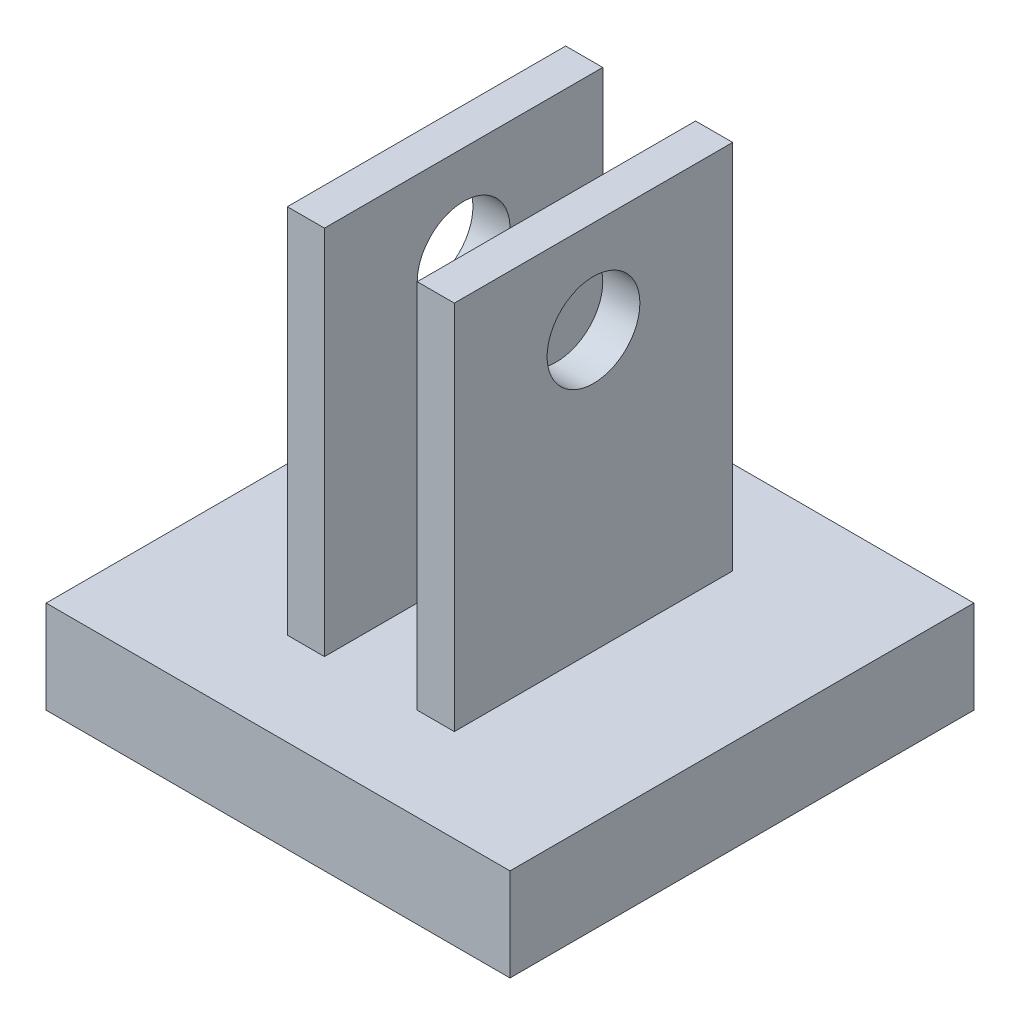
ISO-10303-21;
HEADER;
FILE_DESCRIPTION(('STEP AP214'),'2;1');
FILE_NAME('part.step','',(''),(''),'','','');
FILE_SCHEMA(('AUTOMOTIVE_DESIGN { 1 0 10303 214 1 1 1 1 }'));
ENDSEC;
DATA;
#1=APPLICATION_CONTEXT('core data for automotive mechanical design processes');
#2=APPLICATION_PROTOCOL_DEFINITION('international standard','automotive_design',2000,#1);
#3=PRODUCT_CONTEXT('',#1,'mechanical');
#4=PRODUCT('Part','Part','',(#3));
#5=PRODUCT_RELATED_PRODUCT_CATEGORY('part','',(#4));
#6=PRODUCT_DEFINITION_FORMATION('','',#4);
#7=PRODUCT_DEFINITION_CONTEXT('part definition',#1,'design');
#8=PRODUCT_DEFINITION('design','',#6,#7);
#9=PRODUCT_DEFINITION_SHAPE('','',#8);
#10=(LENGTH_UNIT() NAMED_UNIT(*) SI_UNIT(.MILLI.,.METRE.));
#11=(NAMED_UNIT(*) PLANE_ANGLE_UNIT() SI_UNIT($,.RADIAN.));
#12=(NAMED_UNIT(*) SI_UNIT($,.STERADIAN.) SOLID_ANGLE_UNIT());
#13=UNCERTAINTY_MEASURE_WITH_UNIT(LENGTH_MEASURE(1.E-05),#10,'distance_accuracy_value','');
#14=(GEOMETRIC_REPRESENTATION_CONTEXT(3) GLOBAL_UNCERTAINTY_ASSIGNED_CONTEXT((#13)) GLOBAL_UNIT_ASSIGNED_CONTEXT((#10,
#11,#12)) REPRESENTATION_CONTEXT('',''));
#15=CARTESIAN_POINT('',(0.,0.,0.));
#16=DIRECTION('',(0.,0.,1.));
#17=DIRECTION('',(1.,0.,0.));
#18=AXIS2_PLACEMENT_3D('',#15,#16,#17);
#19=CARTESIAN_POINT('',(0.,5.,0.));
#20=DIRECTION('',(0.,1.,0.));
#21=DIRECTION('',(0.,0.,1.));
#22=AXIS2_PLACEMENT_3D('',#19,#20,#21);
#23=PLANE('',#22);
#24=DIRECTION('',(0.,0.,-1.));
#25=VECTOR('',#24,1.);
#26=CARTESIAN_POINT('',(12.5,5.,-12.5));
#27=LINE('',#26,#25);
#28=CARTESIAN_POINT('',(12.5,5.,12.5));
#29=VERTEX_POINT('',#28);
#30=CARTESIAN_POINT('',(12.5,5.,-12.5));
#31=VERTEX_POINT('',#30);
#32=EDGE_CURVE('E224',#29,#31,#27,.T.);
#33=ORIENTED_EDGE('',*,*,#32,.T.);
#34=DIRECTION('',(-1.,0.,0.));
#35=VECTOR('',#34,1.);
#36=CARTESIAN_POINT('',(-12.5,5.,-12.5));
#37=LINE('',#36,#35);
#38=CARTESIAN_POINT('',(-12.5,5.,-12.5));
#39=VERTEX_POINT('',#38);
#40=EDGE_CURVE('E228',#31,#39,#37,.T.);
#41=ORIENTED_EDGE('',*,*,#40,.T.);
#42=DIRECTION('',(0.,0.,1.));
#43=VECTOR('',#42,1.);
#44=CARTESIAN_POINT('',(-12.5,5.,-12.5));
#45=LINE('',#44,#43);
#46=CARTESIAN_POINT('',(-12.5,5.,12.5));
#47=VERTEX_POINT('',#46);
#48=EDGE_CURVE('E232',#39,#47,#45,.T.);
#49=ORIENTED_EDGE('',*,*,#48,.T.);
#50=DIRECTION('',(1.,0.,0.));
#51=VECTOR('',#50,1.);
#52=CARTESIAN_POINT('',(-12.5,5.,12.5));
#53=LINE('',#52,#51);
#54=EDGE_CURVE('E235',#47,#29,#53,.T.);
#55=ORIENTED_EDGE('',*,*,#54,.T.);
#56=EDGE_LOOP('',(#33,#41,#49,#55));
#57=FACE_BOUND('',#56,.T.);
#58=DIRECTION('',(0.,0.,1.));
#59=VECTOR('',#58,1.);
#60=CARTESIAN_POINT('',(4.5,5.,-7.5));
#61=LINE('',#60,#59);
#62=CARTESIAN_POINT('',(4.5,5.,-7.5));
#63=VERTEX_POINT('',#62);
#64=CARTESIAN_POINT('',(4.5,5.,7.5));
#65=VERTEX_POINT('',#64);
#66=EDGE_CURVE('E203',#63,#65,#61,.T.);
#67=ORIENTED_EDGE('',*,*,#66,.T.);
#68=DIRECTION('',(1.,0.,0.));
#69=VECTOR('',#68,1.);
#70=CARTESIAN_POINT('',(2.5,5.,7.5));
#71=LINE('',#70,#69);
#72=CARTESIAN_POINT('',(2.5,5.,7.5));
#73=VERTEX_POINT('',#72);
#74=EDGE_CURVE('E149',#73,#65,#71,.T.);
#75=ORIENTED_EDGE('',*,*,#74,.F.);
#76=DIRECTION('',(0.,0.,1.));
#77=VECTOR('',#76,1.);
#78=CARTESIAN_POINT('',(2.5,5.,-7.5));
#79=LINE('',#78,#77);
#80=CARTESIAN_POINT('',(2.5,5.,-7.5));
#81=VERTEX_POINT('',#80);
#82=EDGE_CURVE('E188',#81,#73,#79,.T.);
#83=ORIENTED_EDGE('',*,*,#82,.F.);
#84=DIRECTION('',(1.,0.,0.));
#85=VECTOR('',#84,1.);
#86=CARTESIAN_POINT('',(2.5,5.,-7.5));
#87=LINE('',#86,#85);
#88=EDGE_CURVE('E65',#81,#63,#87,.T.);
#89=ORIENTED_EDGE('',*,*,#88,.T.);
#90=EDGE_LOOP('',(#67,#75,#83,#89));
#91=FACE_BOUND('',#90,.T.);
#92=DIRECTION('',(0.,0.,1.));
#93=VECTOR('',#92,1.);
#94=CARTESIAN_POINT('',(-2.5,5.,-7.5));
#95=LINE('',#94,#93);
#96=CARTESIAN_POINT('',(-2.5,5.,-7.5));
#97=VERTEX_POINT('',#96);
#98=CARTESIAN_POINT('',(-2.5,5.,7.5));
#99=VERTEX_POINT('',#98);
#100=EDGE_CURVE('E155',#97,#99,#95,.T.);
#101=ORIENTED_EDGE('',*,*,#100,.T.);
#102=DIRECTION('',(-1.,0.,0.));
#103=VECTOR('',#102,1.);
#104=CARTESIAN_POINT('',(-2.5,5.,7.5));
#105=LINE('',#104,#103);
#106=CARTESIAN_POINT('',(-4.5,5.,7.5));
#107=VERTEX_POINT('',#106);
#108=EDGE_CURVE('E57',#99,#107,#105,.T.);
#109=ORIENTED_EDGE('',*,*,#108,.T.);
#110=DIRECTION('',(0.,0.,1.));
#111=VECTOR('',#110,1.);
#112=CARTESIAN_POINT('',(-4.5,5.,-7.5));
#113=LINE('',#112,#111);
#114=CARTESIAN_POINT('',(-4.5,5.,-7.5));
#115=VERTEX_POINT('',#114);
#116=EDGE_CURVE('E147',#115,#107,#113,.T.);
#117=ORIENTED_EDGE('',*,*,#116,.F.);
#118=DIRECTION('',(-1.,0.,0.));
#119=VECTOR('',#118,1.);
#120=CARTESIAN_POINT('',(-2.5,5.,-7.5));
#121=LINE('',#120,#119);
#122=EDGE_CURVE('E159',#97,#115,#121,.T.);
#123=ORIENTED_EDGE('',*,*,#122,.F.);
#124=EDGE_LOOP('',(#101,#109,#117,#123));
#125=FACE_BOUND('',#124,.T.);
#126=ADVANCED_FACE('F40',(#57,#91,#125),#23,.T.);
#127=CARTESIAN_POINT('',(12.5,5.,-12.5));
#128=DIRECTION('',(-1.,0.,0.));
#129=DIRECTION('',(0.,0.,1.));
#130=AXIS2_PLACEMENT_3D('',#127,#128,#129);
#131=PLANE('',#130);
#132=DIRECTION('',(0.,0.,-1.));
#133=VECTOR('',#132,1.);
#134=CARTESIAN_POINT('',(12.5,0.,-12.5));
#135=LINE('',#134,#133);
#136=CARTESIAN_POINT('',(12.5,0.,12.5));
#137=VERTEX_POINT('',#136);
#138=CARTESIAN_POINT('',(12.5,0.,-12.5));
#139=VERTEX_POINT('',#138);
#140=EDGE_CURVE('E223',#137,#139,#135,.T.);
#141=ORIENTED_EDGE('',*,*,#140,.T.);
#142=DIRECTION('',(0.,-1.,0.));
#143=VECTOR('',#142,1.);
#144=CARTESIAN_POINT('',(12.5,5.,-12.5));
#145=LINE('',#144,#143);
#146=EDGE_CURVE('E11',#31,#139,#145,.T.);
#147=ORIENTED_EDGE('',*,*,#146,.F.);
#148=ORIENTED_EDGE('',*,*,#32,.F.);
#149=DIRECTION('',(0.,-1.,0.));
#150=VECTOR('',#149,1.);
#151=CARTESIAN_POINT('',(12.5,5.,12.5));
#152=LINE('',#151,#150);
#153=EDGE_CURVE('E238',#29,#137,#152,.T.);
#154=ORIENTED_EDGE('',*,*,#153,.T.);
#155=EDGE_LOOP('',(#141,#147,#148,#154));
#156=FACE_BOUND('',#155,.T.);
#157=ADVANCED_FACE('F42',(#156),#131,.F.);
#158=CARTESIAN_POINT('',(-12.5,5.,-12.5));
#159=DIRECTION('',(0.,0.,1.));
#160=DIRECTION('',(1.,0.,0.));
#161=AXIS2_PLACEMENT_3D('',#158,#159,#160);
#162=PLANE('',#161);
#163=DIRECTION('',(-1.,0.,0.));
#164=VECTOR('',#163,1.);
#165=CARTESIAN_POINT('',(-12.5,0.,-12.5));
#166=LINE('',#165,#164);
#167=CARTESIAN_POINT('',(-12.5,0.,-12.5));
#168=VERTEX_POINT('',#167);
#169=EDGE_CURVE('E242',#139,#168,#166,.T.);
#170=ORIENTED_EDGE('',*,*,#169,.T.);
#171=DIRECTION('',(0.,-1.,0.));
#172=VECTOR('',#171,1.);
#173=CARTESIAN_POINT('',(-12.5,5.,-12.5));
#174=LINE('',#173,#172);
#175=EDGE_CURVE('E50',#39,#168,#174,.T.);
#176=ORIENTED_EDGE('',*,*,#175,.F.);
#177=ORIENTED_EDGE('',*,*,#40,.F.);
#178=ORIENTED_EDGE('',*,*,#146,.T.);
#179=EDGE_LOOP('',(#170,#176,#177,#178));
#180=FACE_BOUND('',#179,.T.);
#181=ADVANCED_FACE('F279',(#180),#162,.F.);
#182=CARTESIAN_POINT('',(-12.5,5.,-12.5));
#183=DIRECTION('',(1.,0.,0.));
#184=DIRECTION('',(0.,0.,-1.));
#185=AXIS2_PLACEMENT_3D('',#182,#183,#184);
#186=PLANE('',#185);
#187=DIRECTION('',(0.,0.,1.));
#188=VECTOR('',#187,1.);
#189=CARTESIAN_POINT('',(-12.5,0.,-12.5));
#190=LINE('',#189,#188);
#191=CARTESIAN_POINT('',(-12.5,0.,12.5));
#192=VERTEX_POINT('',#191);
#193=EDGE_CURVE('E245',#168,#192,#190,.T.);
#194=ORIENTED_EDGE('',*,*,#193,.T.);
#195=DIRECTION('',(0.,-1.,0.));
#196=VECTOR('',#195,1.);
#197=CARTESIAN_POINT('',(-12.5,5.,12.5));
#198=LINE('',#197,#196);
#199=EDGE_CURVE('E253',#47,#192,#198,.T.);
#200=ORIENTED_EDGE('',*,*,#199,.F.);
#201=ORIENTED_EDGE('',*,*,#48,.F.);
#202=ORIENTED_EDGE('',*,*,#175,.T.);
#203=EDGE_LOOP('',(#194,#200,#201,#202));
#204=FACE_BOUND('',#203,.T.);
#205=ADVANCED_FACE('F263',(#204),#186,.F.);
#206=CARTESIAN_POINT('',(-12.5,5.,12.5));
#207=DIRECTION('',(0.,0.,-1.));
#208=DIRECTION('',(-1.,0.,0.));
#209=AXIS2_PLACEMENT_3D('',#206,#207,#208);
#210=PLANE('',#209);
#211=DIRECTION('',(1.,0.,0.));
#212=VECTOR('',#211,1.);
#213=CARTESIAN_POINT('',(-12.5,0.,12.5));
#214=LINE('',#213,#212);
#215=EDGE_CURVE('E229',#192,#137,#214,.T.);
#216=ORIENTED_EDGE('',*,*,#215,.T.);
#217=ORIENTED_EDGE('',*,*,#153,.F.);
#218=ORIENTED_EDGE('',*,*,#54,.F.);
#219=ORIENTED_EDGE('',*,*,#199,.T.);
#220=EDGE_LOOP('',(#216,#217,#218,#219));
#221=FACE_BOUND('',#220,.T.);
#222=ADVANCED_FACE('F272',(#221),#210,.F.);
#223=CARTESIAN_POINT('',(0.,0.,0.));
#224=DIRECTION('',(0.,1.,0.));
#225=DIRECTION('',(0.,0.,1.));
#226=AXIS2_PLACEMENT_3D('',#223,#224,#225);
#227=PLANE('',#226);
#228=ORIENTED_EDGE('',*,*,#140,.F.);
#229=ORIENTED_EDGE('',*,*,#215,.F.);
#230=ORIENTED_EDGE('',*,*,#193,.F.);
#231=ORIENTED_EDGE('',*,*,#169,.F.);
#232=EDGE_LOOP('',(#228,#229,#230,#231));
#233=FACE_BOUND('',#232,.T.);
#234=ADVANCED_FACE('F269',(#233),#227,.F.);
#235=CARTESIAN_POINT('',(2.5,25.,7.5));
#236=DIRECTION('',(0.,0.,-1.));
#237=DIRECTION('',(-1.,0.,0.));
#238=AXIS2_PLACEMENT_3D('',#235,#236,#237);
#239=PLANE('',#238);
#240=ORIENTED_EDGE('',*,*,#74,.T.);
#241=DIRECTION('',(0.,-1.,0.));
#242=VECTOR('',#241,1.);
#243=CARTESIAN_POINT('',(4.5,25.,7.5));
#244=LINE('',#243,#242);
#245=CARTESIAN_POINT('',(4.5,25.,7.5));
#246=VERTEX_POINT('',#245);
#247=EDGE_CURVE('E220',#246,#65,#244,.T.);
#248=ORIENTED_EDGE('',*,*,#247,.F.);
#249=DIRECTION('',(1.,0.,0.));
#250=VECTOR('',#249,1.);
#251=CARTESIAN_POINT('',(2.5,25.,7.5));
#252=LINE('',#251,#250);
#253=CARTESIAN_POINT('',(2.5,25.,7.5));
#254=VERTEX_POINT('',#253);
#255=EDGE_CURVE('E184',#254,#246,#252,.T.);
#256=ORIENTED_EDGE('',*,*,#255,.F.);
#257=DIRECTION('',(0.,-1.,0.));
#258=VECTOR('',#257,1.);
#259=CARTESIAN_POINT('',(2.5,25.,7.5));
#260=LINE('',#259,#258);
#261=EDGE_CURVE('E199',#254,#73,#260,.T.);
#262=ORIENTED_EDGE('',*,*,#261,.T.);
#263=EDGE_LOOP('',(#240,#248,#256,#262));
#264=FACE_BOUND('',#263,.T.);
#265=ADVANCED_FACE('F292',(#264),#239,.F.);
#266=CARTESIAN_POINT('',(4.5,25.,-7.5));
#267=DIRECTION('',(1.,0.,0.));
#268=DIRECTION('',(0.,0.,-1.));
#269=AXIS2_PLACEMENT_3D('',#266,#267,#268);
#270=PLANE('',#269);
#271=CARTESIAN_POINT('',(4.5,20.,0.));
#272=DIRECTION('',(1.,0.,0.));
#273=DIRECTION('',(0.,0.,-1.));
#274=AXIS2_PLACEMENT_3D('',#271,#272,#273);
#275=CIRCLE('',#274,2.5);
#276=CARTESIAN_POINT('',(4.5,20.,-2.5));
#277=VERTEX_POINT('',#276);
#278=EDGE_CURVE('E162',#277,#277,#275,.T.);
#279=ORIENTED_EDGE('',*,*,#278,.F.);
#280=EDGE_LOOP('',(#279));
#281=FACE_BOUND('',#280,.T.);
#282=ORIENTED_EDGE('',*,*,#66,.F.);
#283=DIRECTION('',(0.,-1.,0.));
#284=VECTOR('',#283,1.);
#285=CARTESIAN_POINT('',(4.5,25.,-7.5));
#286=LINE('',#285,#284);
#287=CARTESIAN_POINT('',(4.5,25.,-7.5));
#288=VERTEX_POINT('',#287);
#289=EDGE_CURVE('E217',#288,#63,#286,.T.);
#290=ORIENTED_EDGE('',*,*,#289,.F.);
#291=DIRECTION('',(0.,0.,1.));
#292=VECTOR('',#291,1.);
#293=CARTESIAN_POINT('',(4.5,25.,-7.5));
#294=LINE('',#293,#292);
#295=EDGE_CURVE('E187',#288,#246,#294,.T.);
#296=ORIENTED_EDGE('',*,*,#295,.T.);
#297=ORIENTED_EDGE('',*,*,#247,.T.);
#298=EDGE_LOOP('',(#282,#290,#296,#297));
#299=FACE_BOUND('',#298,.T.);
#300=ADVANCED_FACE('F313',(#281,#299),#270,.T.);
#301=CARTESIAN_POINT('',(2.5,25.,-7.5));
#302=DIRECTION('',(0.,0.,-1.));
#303=DIRECTION('',(-1.,0.,0.));
#304=AXIS2_PLACEMENT_3D('',#301,#302,#303);
#305=PLANE('',#304);
#306=ORIENTED_EDGE('',*,*,#88,.F.);
#307=DIRECTION('',(0.,-1.,0.));
#308=VECTOR('',#307,1.);
#309=CARTESIAN_POINT('',(2.5,25.,-7.5));
#310=LINE('',#309,#308);
#311=CARTESIAN_POINT('',(2.5,25.,-7.5));
#312=VERTEX_POINT('',#311);
#313=EDGE_CURVE('E214',#312,#81,#310,.T.);
#314=ORIENTED_EDGE('',*,*,#313,.F.);
#315=DIRECTION('',(1.,0.,0.));
#316=VECTOR('',#315,1.);
#317=CARTESIAN_POINT('',(2.5,25.,-7.5));
#318=LINE('',#317,#316);
#319=EDGE_CURVE('E192',#312,#288,#318,.T.);
#320=ORIENTED_EDGE('',*,*,#319,.T.);
#321=ORIENTED_EDGE('',*,*,#289,.T.);
#322=EDGE_LOOP('',(#306,#314,#320,#321));
#323=FACE_BOUND('',#322,.T.);
#324=ADVANCED_FACE('F323',(#323),#305,.T.);
#325=CARTESIAN_POINT('',(2.5,25.,-7.5));
#326=DIRECTION('',(1.,0.,0.));
#327=DIRECTION('',(0.,0.,-1.));
#328=AXIS2_PLACEMENT_3D('',#325,#326,#327);
#329=PLANE('',#328);
#330=CARTESIAN_POINT('',(2.5,20.,0.));
#331=DIRECTION('',(1.,0.,0.));
#332=DIRECTION('',(0.,0.,-1.));
#333=AXIS2_PLACEMENT_3D('',#330,#331,#332);
#334=CIRCLE('',#333,2.5);
#335=CARTESIAN_POINT('',(2.5,20.,-2.5));
#336=VERTEX_POINT('',#335);
#337=EDGE_CURVE('E440',#336,#336,#334,.T.);
#338=ORIENTED_EDGE('',*,*,#337,.T.);
#339=EDGE_LOOP('',(#338));
#340=FACE_BOUND('',#339,.T.);
#341=ORIENTED_EDGE('',*,*,#82,.T.);
#342=ORIENTED_EDGE('',*,*,#261,.F.);
#343=DIRECTION('',(0.,0.,1.));
#344=VECTOR('',#343,1.);
#345=CARTESIAN_POINT('',(2.5,25.,-7.5));
#346=LINE('',#345,#344);
#347=EDGE_CURVE('E196',#312,#254,#346,.T.);
#348=ORIENTED_EDGE('',*,*,#347,.F.);
#349=ORIENTED_EDGE('',*,*,#313,.T.);
#350=EDGE_LOOP('',(#341,#342,#348,#349));
#351=FACE_BOUND('',#350,.T.);
#352=ADVANCED_FACE('F331',(#340,#351),#329,.F.);
#353=CARTESIAN_POINT('',(0.,25.,0.));
#354=DIRECTION('',(0.,-1.,0.));
#355=DIRECTION('',(0.,0.,-1.));
#356=AXIS2_PLACEMENT_3D('',#353,#354,#355);
#357=PLANE('',#356);
#358=ORIENTED_EDGE('',*,*,#255,.T.);
#359=ORIENTED_EDGE('',*,*,#295,.F.);
#360=ORIENTED_EDGE('',*,*,#319,.F.);
#361=ORIENTED_EDGE('',*,*,#347,.T.);
#362=EDGE_LOOP('',(#358,#359,#360,#361));
#363=FACE_BOUND('',#362,.T.);
#364=ADVANCED_FACE('F339',(#363),#357,.F.);
#365=CARTESIAN_POINT('',(-2.5,25.,7.5));
#366=DIRECTION('',(0.,0.,-1.));
#367=DIRECTION('',(1.,0.,0.));
#368=AXIS2_PLACEMENT_3D('',#365,#366,#367);
#369=PLANE('',#368);
#370=ORIENTED_EDGE('',*,*,#108,.F.);
#371=DIRECTION('',(0.,-1.,0.));
#372=VECTOR('',#371,1.);
#373=CARTESIAN_POINT('',(-2.5,25.,7.5));
#374=LINE('',#373,#372);
#375=CARTESIAN_POINT('',(-2.5,25.,7.5));
#376=VERTEX_POINT('',#375);
#377=EDGE_CURVE('E153',#376,#99,#374,.T.);
#378=ORIENTED_EDGE('',*,*,#377,.F.);
#379=DIRECTION('',(-1.,0.,0.));
#380=VECTOR('',#379,1.);
#381=CARTESIAN_POINT('',(-2.5,25.,7.5));
#382=LINE('',#381,#380);
#383=CARTESIAN_POINT('',(-4.5,25.,7.5));
#384=VERTEX_POINT('',#383);
#385=EDGE_CURVE('E136',#376,#384,#382,.T.);
#386=ORIENTED_EDGE('',*,*,#385,.T.);
#387=DIRECTION('',(0.,-1.,0.));
#388=VECTOR('',#387,1.);
#389=CARTESIAN_POINT('',(-4.5,25.,7.5));
#390=LINE('',#389,#388);
#391=EDGE_CURVE('E144',#384,#107,#390,.T.);
#392=ORIENTED_EDGE('',*,*,#391,.T.);
#393=EDGE_LOOP('',(#370,#378,#386,#392));
#394=FACE_BOUND('',#393,.T.);
#395=ADVANCED_FACE('F152',(#394),#369,.F.);
#396=CARTESIAN_POINT('',(-4.5,25.,-7.5));
#397=DIRECTION('',(-1.,0.,0.));
#398=DIRECTION('',(0.,0.,-1.));
#399=AXIS2_PLACEMENT_3D('',#396,#397,#398);
#400=PLANE('',#399);
#401=CARTESIAN_POINT('',(-4.5,20.,0.));
#402=DIRECTION('',(-1.,0.,0.));
#403=DIRECTION('',(0.,0.,1.));
#404=AXIS2_PLACEMENT_3D('',#401,#402,#403);
#405=CIRCLE('',#404,2.5);
#406=CARTESIAN_POINT('',(-4.5,20.,2.5));
#407=VERTEX_POINT('',#406);
#408=EDGE_CURVE('E445',#407,#407,#405,.T.);
#409=ORIENTED_EDGE('',*,*,#408,.F.);
#410=EDGE_LOOP('',(#409));
#411=FACE_BOUND('',#410,.T.);
#412=ORIENTED_EDGE('',*,*,#116,.T.);
#413=ORIENTED_EDGE('',*,*,#391,.F.);
#414=DIRECTION('',(0.,0.,1.));
#415=VECTOR('',#414,1.);
#416=CARTESIAN_POINT('',(-4.5,25.,-7.5));
#417=LINE('',#416,#415);
#418=CARTESIAN_POINT('',(-4.5,25.,-7.5));
#419=VERTEX_POINT('',#418);
#420=EDGE_CURVE('E132',#419,#384,#417,.T.);
#421=ORIENTED_EDGE('',*,*,#420,.F.);
#422=DIRECTION('',(0.,-1.,0.));
#423=VECTOR('',#422,1.);
#424=CARTESIAN_POINT('',(-4.5,25.,-7.5));
#425=LINE('',#424,#423);
#426=EDGE_CURVE('E150',#419,#115,#425,.T.);
#427=ORIENTED_EDGE('',*,*,#426,.T.);
#428=EDGE_LOOP('',(#412,#413,#421,#427));
#429=FACE_BOUND('',#428,.T.);
#430=ADVANCED_FACE('F145',(#411,#429),#400,.T.);
#431=CARTESIAN_POINT('',(-2.5,25.,-7.5));
#432=DIRECTION('',(0.,0.,-1.));
#433=DIRECTION('',(1.,0.,0.));
#434=AXIS2_PLACEMENT_3D('',#431,#432,#433);
#435=PLANE('',#434);
#436=ORIENTED_EDGE('',*,*,#122,.T.);
#437=ORIENTED_EDGE('',*,*,#426,.F.);
#438=DIRECTION('',(-1.,0.,0.));
#439=VECTOR('',#438,1.);
#440=CARTESIAN_POINT('',(-2.5,25.,-7.5));
#441=LINE('',#440,#439);
#442=CARTESIAN_POINT('',(-2.5,25.,-7.5));
#443=VERTEX_POINT('',#442);
#444=EDGE_CURVE('E138',#443,#419,#441,.T.);
#445=ORIENTED_EDGE('',*,*,#444,.F.);
#446=DIRECTION('',(0.,-1.,0.));
#447=VECTOR('',#446,1.);
#448=CARTESIAN_POINT('',(-2.5,25.,-7.5));
#449=LINE('',#448,#447);
#450=EDGE_CURVE('E179',#443,#97,#449,.T.);
#451=ORIENTED_EDGE('',*,*,#450,.T.);
#452=EDGE_LOOP('',(#436,#437,#445,#451));
#453=FACE_BOUND('',#452,.T.);
#454=ADVANCED_FACE('F361',(#453),#435,.T.);
#455=CARTESIAN_POINT('',(-2.5,25.,-7.5));
#456=DIRECTION('',(-1.,0.,0.));
#457=DIRECTION('',(0.,0.,-1.));
#458=AXIS2_PLACEMENT_3D('',#455,#456,#457);
#459=PLANE('',#458);
#460=CARTESIAN_POINT('',(-2.5,20.,0.));
#461=DIRECTION('',(-1.,0.,0.));
#462=DIRECTION('',(0.,0.,1.));
#463=AXIS2_PLACEMENT_3D('',#460,#461,#462);
#464=CIRCLE('',#463,2.5);
#465=CARTESIAN_POINT('',(-2.5,20.,2.5));
#466=VERTEX_POINT('',#465);
#467=EDGE_CURVE('E44',#466,#466,#464,.T.);
#468=ORIENTED_EDGE('',*,*,#467,.T.);
#469=EDGE_LOOP('',(#468));
#470=FACE_BOUND('',#469,.T.);
#471=ORIENTED_EDGE('',*,*,#100,.F.);
#472=ORIENTED_EDGE('',*,*,#450,.F.);
#473=DIRECTION('',(0.,0.,1.));
#474=VECTOR('',#473,1.);
#475=CARTESIAN_POINT('',(-2.5,25.,-7.5));
#476=LINE('',#475,#474);
#477=EDGE_CURVE('E167',#443,#376,#476,.T.);
#478=ORIENTED_EDGE('',*,*,#477,.T.);
#479=ORIENTED_EDGE('',*,*,#377,.T.);
#480=EDGE_LOOP('',(#471,#472,#478,#479));
#481=FACE_BOUND('',#480,.T.);
#482=ADVANCED_FACE('F369',(#470,#481),#459,.F.);
#483=CARTESIAN_POINT('',(0.,25.,0.));
#484=DIRECTION('',(0.,-1.,0.));
#485=DIRECTION('',(0.,0.,-1.));
#486=AXIS2_PLACEMENT_3D('',#483,#484,#485);
#487=PLANE('',#486);
#488=ORIENTED_EDGE('',*,*,#385,.F.);
#489=ORIENTED_EDGE('',*,*,#477,.F.);
#490=ORIENTED_EDGE('',*,*,#444,.T.);
#491=ORIENTED_EDGE('',*,*,#420,.T.);
#492=EDGE_LOOP('',(#488,#489,#490,#491));
#493=FACE_BOUND('',#492,.T.);
#494=ADVANCED_FACE('F134',(#493),#487,.F.);
#495=CARTESIAN_POINT('',(12.5,20.,0.));
#496=DIRECTION('',(-1.,0.,0.));
#497=DIRECTION('',(0.,0.,1.));
#498=AXIS2_PLACEMENT_3D('',#495,#496,#497);
#499=CYLINDRICAL_SURFACE('',#498,2.5);
#500=ORIENTED_EDGE('',*,*,#408,.T.);
#501=EDGE_LOOP('',(#500));
#502=FACE_BOUND('',#501,.T.);
#503=ORIENTED_EDGE('',*,*,#467,.F.);
#504=EDGE_LOOP('',(#503));
#505=FACE_BOUND('',#504,.T.);
#506=ADVANCED_FACE('F383',(#502,#505),#499,.F.);
#507=ORIENTED_EDGE('',*,*,#278,.T.);
#508=EDGE_LOOP('',(#507));
#509=FACE_BOUND('',#508,.T.);
#510=ORIENTED_EDGE('',*,*,#337,.F.);
#511=EDGE_LOOP('',(#510));
#512=FACE_BOUND('',#511,.T.);
#513=ADVANCED_FACE('F389',(#509,#512),#499,.F.);
#514=CLOSED_SHELL('',(#126,#157,#181,#205,#222,#234,#265,#300,#324,#352,#364,#395,#430,#454,
#482,#494,#506,#513));
#515=MANIFOLD_SOLID_BREP('B2',#514);
#516=ADVANCED_BREP_SHAPE_REPRESENTATION('',(#18,#515),#14);
#517=SHAPE_DEFINITION_REPRESENTATION(#9,#516);
ENDSEC;
END-ISO-10303-21;
